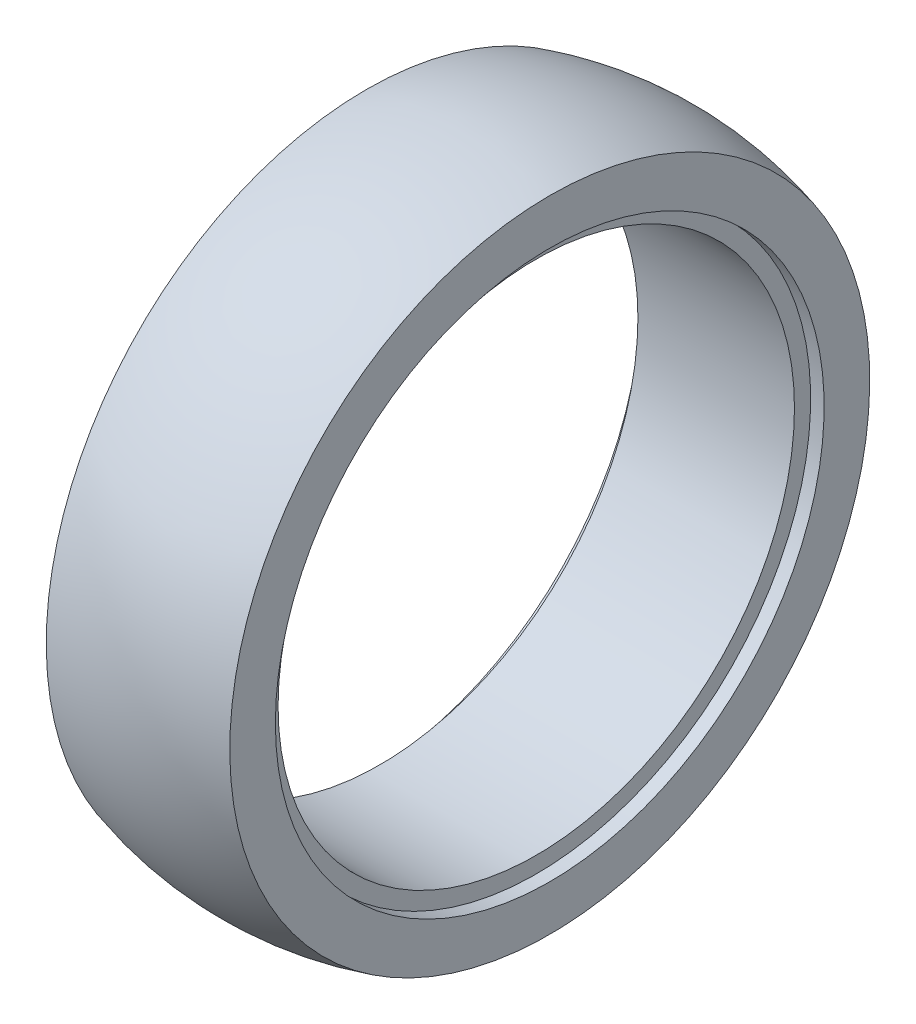
ISO-10303-21;
HEADER;
FILE_DESCRIPTION(('STEP AP214'),'2;1');
FILE_NAME('part.step','',(''),(''),'','','');
FILE_SCHEMA(('AUTOMOTIVE_DESIGN { 1 0 10303 214 1 1 1 1 }'));
ENDSEC;
DATA;
#1=APPLICATION_CONTEXT('core data for automotive mechanical design processes');
#2=APPLICATION_PROTOCOL_DEFINITION('international standard','automotive_design',2000,#1);
#3=PRODUCT_CONTEXT('',#1,'mechanical');
#4=PRODUCT('Part','Part','',(#3));
#5=PRODUCT_RELATED_PRODUCT_CATEGORY('part','',(#4));
#6=PRODUCT_DEFINITION_FORMATION('','',#4);
#7=PRODUCT_DEFINITION_CONTEXT('part definition',#1,'design');
#8=PRODUCT_DEFINITION('design','',#6,#7);
#9=PRODUCT_DEFINITION_SHAPE('','',#8);
#10=(LENGTH_UNIT() NAMED_UNIT(*) SI_UNIT(.MILLI.,.METRE.));
#11=(NAMED_UNIT(*) PLANE_ANGLE_UNIT() SI_UNIT($,.RADIAN.));
#12=(NAMED_UNIT(*) SI_UNIT($,.STERADIAN.) SOLID_ANGLE_UNIT());
#13=UNCERTAINTY_MEASURE_WITH_UNIT(LENGTH_MEASURE(1.E-05),#10,'distance_accuracy_value','');
#14=(GEOMETRIC_REPRESENTATION_CONTEXT(3) GLOBAL_UNCERTAINTY_ASSIGNED_CONTEXT((#13)) GLOBAL_UNIT_ASSIGNED_CONTEXT((#10,
#11,#12)) REPRESENTATION_CONTEXT('',''));
#15=CARTESIAN_POINT('',(0.,0.,0.));
#16=DIRECTION('',(0.,0.,1.));
#17=DIRECTION('',(1.,0.,0.));
#18=AXIS2_PLACEMENT_3D('',#15,#16,#17);
#19=CARTESIAN_POINT('',(47.25,0.,0.));
#20=DIRECTION('',(-1.,0.,0.));
#21=DIRECTION('',(0.,0.,1.));
#22=AXIS2_PLACEMENT_3D('',#19,#20,#21);
#23=PLANE('',#22);
#24=CARTESIAN_POINT('',(47.25,0.,0.));
#25=DIRECTION('',(-1.,0.,0.));
#26=DIRECTION('',(0.,0.,1.));
#27=AXIS2_PLACEMENT_3D('',#24,#25,#26);
#28=CIRCLE('',#27,88.9156904038877);
#29=CARTESIAN_POINT('',(47.25,88.9156904038877,0.));
#30=VERTEX_POINT('',#29);
#31=EDGE_CURVE('E10',#30,#30,#28,.T.);
#32=ORIENTED_EDGE('',*,*,#31,.F.);
#33=EDGE_LOOP('',(#32));
#34=FACE_BOUND('',#33,.T.);
#35=CARTESIAN_POINT('',(47.25,0.,0.));
#36=DIRECTION('',(-1.,0.,0.));
#37=DIRECTION('',(0.,0.,1.));
#38=AXIS2_PLACEMENT_3D('',#35,#36,#37);
#39=CIRCLE('',#38,76.25);
#40=CARTESIAN_POINT('',(47.25,0.,76.25));
#41=VERTEX_POINT('',#40);
#42=EDGE_CURVE('E62',#41,#41,#39,.T.);
#43=ORIENTED_EDGE('',*,*,#42,.T.);
#44=EDGE_LOOP('',(#43));
#45=FACE_BOUND('',#44,.T.);
#46=ADVANCED_FACE('F34',(#34,#45),#23,.F.);
#47=CARTESIAN_POINT('',(21.75,0.,0.));
#48=DIRECTION('',(-1.,0.,0.));
#49=DIRECTION('',(0.,1.,0.));
#50=AXIS2_PLACEMENT_3D('',#47,#48,#49);
#51=SPHERICAL_SURFACE('',#50,92.5);
#52=CARTESIAN_POINT('',(-3.75,0.,0.));
#53=DIRECTION('',(-1.,0.,0.));
#54=DIRECTION('',(0.,0.,1.));
#55=AXIS2_PLACEMENT_3D('',#52,#53,#54);
#56=CIRCLE('',#55,88.9156904038877);
#57=CARTESIAN_POINT('',(-3.75,88.9156904038877,0.));
#58=VERTEX_POINT('',#57);
#59=EDGE_CURVE('E40',#58,#58,#56,.T.);
#60=CARTESIAN_POINT('',(-3.75,88.9156904038877,0.));
#61=CARTESIAN_POINT('',(-3.23263577010854,89.0640650646736,0.));
#62=CARTESIAN_POINT('',(-2.71397628318609,89.2079232505323,0.));
#63=CARTESIAN_POINT('',(-1.67422541349313,89.4865650199741,0.));
#64=CARTESIAN_POINT('',(-1.15313403072262,89.6213486035571,0.));
#65=CARTESIAN_POINT('',(-0.108677987547447,89.8817995160262,0.));
#66=CARTESIAN_POINT('',(0.414686672857211,90.0074668449123,0.));
#67=CARTESIAN_POINT('',(1.46352976187883,90.2496471141387,0.));
#68=CARTESIAN_POINT('',(1.98900819049579,90.366160054479,0.));
#69=CARTESIAN_POINT('',(3.0419187156628,90.5899960035581,0.));
#70=CARTESIAN_POINT('',(3.56935081221285,90.697319012297,0.));
#71=CARTESIAN_POINT('',(4.62600796343561,90.902742408452,0.));
#72=CARTESIAN_POINT('',(5.15523301810833,91.0008427958682,0.));
#73=CARTESIAN_POINT('',(6.21531483327732,91.1877910555055,0.));
#74=CARTESIAN_POINT('',(6.7461715937736,91.2766389277266,0.));
#75=CARTESIAN_POINT('',(7.8093550700918,91.445055086131,0.));
#76=CARTESIAN_POINT('',(8.34168178591373,91.5246233723142,0.));
#77=CARTESIAN_POINT('',(9.40764297476909,91.6744561142356,0.));
#78=CARTESIAN_POINT('',(9.94127744780253,91.7447205699738,0.));
#79=CARTESIAN_POINT('',(11.009691554424,91.8759242417179,0.));
#80=CARTESIAN_POINT('',(11.5444711880121,91.9368634577239,0.));
#81=CARTESIAN_POINT('',(12.6150126701791,92.0493980820128,0.));
#82=CARTESIAN_POINT('',(13.150774518758,92.1009934902957,0.));
#83=CARTESIAN_POINT('',(14.22311718606,92.1948247781937,0.));
#84=CARTESIAN_POINT('',(14.7596980047831,92.2370606578089,0.));
#85=CARTESIAN_POINT('',(15.8335151179907,92.3121600192393,0.));
#86=CARTESIAN_POINT('',(16.3707514124752,92.3450235010544,0.));
#87=CARTESIAN_POINT('',(17.4457157831013,92.4013680534917,0.));
#88=CARTESIAN_POINT('',(17.9834438592428,92.4248491241138,0.));
#89=CARTESIAN_POINT('',(19.0592279492344,92.4624216995612,0.));
#90=CARTESIAN_POINT('',(19.5972839630845,92.4765132043865,0.));
#91=CARTESIAN_POINT('',(20.673559984623,92.4953023546059,0.));
#92=CARTESIAN_POINT('',(21.2117799923115,92.5,0.));
#93=CARTESIAN_POINT('',(22.2882200076885,92.5,0.));
#94=CARTESIAN_POINT('',(22.826440015377,92.4953023546059,0.));
#95=CARTESIAN_POINT('',(23.9027160369155,92.4765132043865,0.));
#96=CARTESIAN_POINT('',(24.4407720507656,92.4624216995612,0.));
#97=CARTESIAN_POINT('',(25.5165561407572,92.4248491241138,0.));
#98=CARTESIAN_POINT('',(26.0542842168987,92.4013680534916,0.));
#99=CARTESIAN_POINT('',(27.1292485875248,92.3450235010544,0.));
#100=CARTESIAN_POINT('',(27.6664848820093,92.3121600192393,0.));
#101=CARTESIAN_POINT('',(28.7403019952169,92.237060657809,0.));
#102=CARTESIAN_POINT('',(29.27688281394,92.1948247781937,0.));
#103=CARTESIAN_POINT('',(30.349225481242,92.1009934902957,0.));
#104=CARTESIAN_POINT('',(30.8849873298209,92.0493980820128,0.));
#105=CARTESIAN_POINT('',(31.9555288119879,91.9368634577239,0.));
#106=CARTESIAN_POINT('',(32.490308445576,91.8759242417179,0.));
#107=CARTESIAN_POINT('',(33.5587225521975,91.7447205699738,0.));
#108=CARTESIAN_POINT('',(34.0923570252309,91.6744561142356,0.));
#109=CARTESIAN_POINT('',(35.1583182140863,91.5246233723142,0.));
#110=CARTESIAN_POINT('',(35.6906449299082,91.445055086131,0.));
#111=CARTESIAN_POINT('',(36.7538284062264,91.2766389277266,0.));
#112=CARTESIAN_POINT('',(37.2846851667227,91.1877910555055,0.));
#113=CARTESIAN_POINT('',(38.3447669818917,91.0008427958682,0.));
#114=CARTESIAN_POINT('',(38.8739920365644,90.902742408452,0.));
#115=CARTESIAN_POINT('',(39.9306491877872,90.697319012297,0.));
#116=CARTESIAN_POINT('',(40.4580812843372,90.5899960035581,0.));
#117=CARTESIAN_POINT('',(41.5109918095042,90.366160054479,0.));
#118=CARTESIAN_POINT('',(42.0364702381212,90.2496471141387,0.));
#119=CARTESIAN_POINT('',(43.0853133271428,90.0074668449123,0.));
#120=CARTESIAN_POINT('',(43.6086779875475,89.8817995160262,0.));
#121=CARTESIAN_POINT('',(44.6531340307226,89.6213486035571,0.));
#122=CARTESIAN_POINT('',(45.1742254134931,89.4865650199741,0.));
#123=CARTESIAN_POINT('',(46.2139762831861,89.2079232505324,0.));
#124=CARTESIAN_POINT('',(46.7326357701086,89.0640650646736,0.));
#125=CARTESIAN_POINT('',(47.25,88.9156904038877,0.));
#126=B_SPLINE_CURVE_WITH_KNOTS('',3,(#60,#61,#62,#63,#64,#65,#66,#67,#68,#69,#70,#71,#72,#73,
#74,#75,#76,#77,#78,#79,#80,#81,#82,#83,#84,#85,#86,#87,#88,#89,#90,#91,#92,#93,#94,#95,#96,#97,
#98,#99,#100,#101,#102,#103,#104,#105,#106,#107,#108,#109,#110,#111,#112,#113,#114,#115,#116,
#117,#118,#119,#120,#121,#122,#123,#124,#125),.UNSPECIFIED.,.F.,.F.,(4,2,2,2,2,2,2,2,2,2,2,2,2,
2,2,2,2,2,2,2,2,2,2,2,2,2,2,2,2,2,2,2,4),(0.,1.61463952422609,3.22927904845219,4.84391857267828,
6.45855809690437,8.07319762113047,9.68783714535656,11.3024766695827,12.9171161938087,
14.5317557180348,16.1463952422609,17.761034766487,19.3756742907131,20.9903138149392,
22.6049533391653,24.2195928633914,25.8342323876175,27.4488719118436,29.0635114360697,
30.6781509602958,32.2927904845218,33.9074300087479,35.522069532974,37.1367090572001,
38.7513485814262,40.3659881056523,41.9806276298784,43.5952671541045,45.2099066783306,
46.8245462025567,48.4391857267828,50.0538252510089,51.668464775235),.UNSPECIFIED.);
#127=EDGE_CURVE('BSEAM79',#58,#30,#126,.T.);
#128=ORIENTED_EDGE('',*,*,#59,.F.);
#129=ORIENTED_EDGE('',*,*,#31,.T.);
#130=ORIENTED_EDGE('',*,*,#127,.T.);
#131=ORIENTED_EDGE('',*,*,#127,.F.);
#132=EDGE_LOOP('',(#128,#130,#129,#131));
#133=FACE_BOUND('',#132,.T.);
#134=ADVANCED_FACE('F79',(#133),#51,.T.);
#135=CARTESIAN_POINT('',(-3.75,0.,0.));
#136=DIRECTION('',(-1.,0.,0.));
#137=DIRECTION('',(0.,0.,1.));
#138=AXIS2_PLACEMENT_3D('',#135,#136,#137);
#139=PLANE('',#138);
#140=ORIENTED_EDGE('',*,*,#59,.T.);
#141=EDGE_LOOP('',(#140));
#142=FACE_BOUND('',#141,.T.);
#143=CARTESIAN_POINT('',(-3.75,0.,0.));
#144=DIRECTION('',(-1.,0.,0.));
#145=DIRECTION('',(0.,0.,1.));
#146=AXIS2_PLACEMENT_3D('',#143,#144,#145);
#147=CIRCLE('',#146,76.25);
#148=CARTESIAN_POINT('',(-3.75,0.,76.25));
#149=VERTEX_POINT('',#148);
#150=EDGE_CURVE('E44',#149,#149,#147,.T.);
#151=ORIENTED_EDGE('',*,*,#150,.F.);
#152=EDGE_LOOP('',(#151));
#153=FACE_BOUND('',#152,.T.);
#154=ADVANCED_FACE('F84',(#142,#153),#139,.T.);
#155=CARTESIAN_POINT('',(0.,0.,0.));
#156=DIRECTION('',(-1.,0.,0.));
#157=DIRECTION('',(0.,0.,1.));
#158=AXIS2_PLACEMENT_3D('',#155,#156,#157);
#159=CYLINDRICAL_SURFACE('',#158,76.25);
#160=CARTESIAN_POINT('',(2.35151404521301E-13,0.,0.));
#161=DIRECTION('',(-1.,0.,0.));
#162=DIRECTION('',(0.,0.,1.));
#163=AXIS2_PLACEMENT_3D('',#160,#161,#162);
#164=CIRCLE('',#163,76.25);
#165=CARTESIAN_POINT('',(2.35151404521301E-13,0.,76.25));
#166=VERTEX_POINT('',#165);
#167=EDGE_CURVE('E48',#166,#166,#164,.T.);
#168=ORIENTED_EDGE('',*,*,#167,.F.);
#169=EDGE_LOOP('',(#168));
#170=FACE_BOUND('',#169,.T.);
#171=ORIENTED_EDGE('',*,*,#150,.T.);
#172=EDGE_LOOP('',(#171));
#173=FACE_BOUND('',#172,.T.);
#174=ADVANCED_FACE('F89',(#170,#173),#159,.F.);
#175=CARTESIAN_POINT('',(1.14106255308697E-13,0.,0.));
#176=DIRECTION('',(-1.,0.,0.));
#177=DIRECTION('',(0.,0.,1.));
#178=AXIS2_PLACEMENT_3D('',#175,#176,#177);
#179=PLANE('',#178);
#180=ORIENTED_EDGE('',*,*,#167,.T.);
#181=EDGE_LOOP('',(#180));
#182=FACE_BOUND('',#181,.T.);
#183=CARTESIAN_POINT('',(0.,0.,0.));
#184=DIRECTION('',(-1.,0.,0.));
#185=DIRECTION('',(0.,0.,1.));
#186=AXIS2_PLACEMENT_3D('',#183,#184,#185);
#187=CIRCLE('',#186,71.75);
#188=CARTESIAN_POINT('',(0.,0.,71.75));
#189=VERTEX_POINT('',#188);
#190=EDGE_CURVE('E53',#189,#189,#187,.T.);
#191=ORIENTED_EDGE('',*,*,#190,.F.);
#192=EDGE_LOOP('',(#191));
#193=FACE_BOUND('',#192,.T.);
#194=ADVANCED_FACE('F94',(#182,#193),#179,.T.);
#195=CARTESIAN_POINT('',(0.,0.,0.));
#196=DIRECTION('',(-1.,0.,0.));
#197=DIRECTION('',(0.,0.,1.));
#198=AXIS2_PLACEMENT_3D('',#195,#196,#197);
#199=CYLINDRICAL_SURFACE('',#198,71.75);
#200=CARTESIAN_POINT('',(43.5,0.,0.));
#201=DIRECTION('',(-1.,0.,0.));
#202=DIRECTION('',(0.,0.,1.));
#203=AXIS2_PLACEMENT_3D('',#200,#201,#202);
#204=CIRCLE('',#203,71.75);
#205=CARTESIAN_POINT('',(43.5,0.,71.75));
#206=VERTEX_POINT('',#205);
#207=EDGE_CURVE('E56',#206,#206,#204,.T.);
#208=ORIENTED_EDGE('',*,*,#207,.F.);
#209=EDGE_LOOP('',(#208));
#210=FACE_BOUND('',#209,.T.);
#211=ORIENTED_EDGE('',*,*,#190,.T.);
#212=EDGE_LOOP('',(#211));
#213=FACE_BOUND('',#212,.T.);
#214=ADVANCED_FACE('F75',(#210,#213),#199,.F.);
#215=CARTESIAN_POINT('',(43.5,0.,0.));
#216=DIRECTION('',(1.,0.,0.));
#217=DIRECTION('',(0.,0.,-1.));
#218=AXIS2_PLACEMENT_3D('',#215,#216,#217);
#219=PLANE('',#218);
#220=ORIENTED_EDGE('',*,*,#207,.T.);
#221=EDGE_LOOP('',(#220));
#222=FACE_BOUND('',#221,.T.);
#223=CARTESIAN_POINT('',(43.5,0.,0.));
#224=DIRECTION('',(-1.,0.,0.));
#225=DIRECTION('',(0.,0.,1.));
#226=AXIS2_PLACEMENT_3D('',#223,#224,#225);
#227=CIRCLE('',#226,76.25);
#228=CARTESIAN_POINT('',(43.5,0.,76.25));
#229=VERTEX_POINT('',#228);
#230=EDGE_CURVE('E59',#229,#229,#227,.T.);
#231=ORIENTED_EDGE('',*,*,#230,.F.);
#232=EDGE_LOOP('',(#231));
#233=FACE_BOUND('',#232,.T.);
#234=ADVANCED_FACE('F69',(#222,#233),#219,.T.);
#235=CARTESIAN_POINT('',(0.,0.,0.));
#236=DIRECTION('',(-1.,0.,0.));
#237=DIRECTION('',(0.,0.,1.));
#238=AXIS2_PLACEMENT_3D('',#235,#236,#237);
#239=CYLINDRICAL_SURFACE('',#238,76.25);
#240=ORIENTED_EDGE('',*,*,#230,.T.);
#241=EDGE_LOOP('',(#240));
#242=FACE_BOUND('',#241,.T.);
#243=ORIENTED_EDGE('',*,*,#42,.F.);
#244=EDGE_LOOP('',(#243));
#245=FACE_BOUND('',#244,.T.);
#246=ADVANCED_FACE('F67',(#242,#245),#239,.F.);
#247=CLOSED_SHELL('',(#46,#134,#154,#174,#194,#214,#234,#246));
#248=MANIFOLD_SOLID_BREP('B2',#247);
#249=ADVANCED_BREP_SHAPE_REPRESENTATION('',(#18,#248),#14);
#250=SHAPE_DEFINITION_REPRESENTATION(#9,#249);
ENDSEC;
END-ISO-10303-21;
